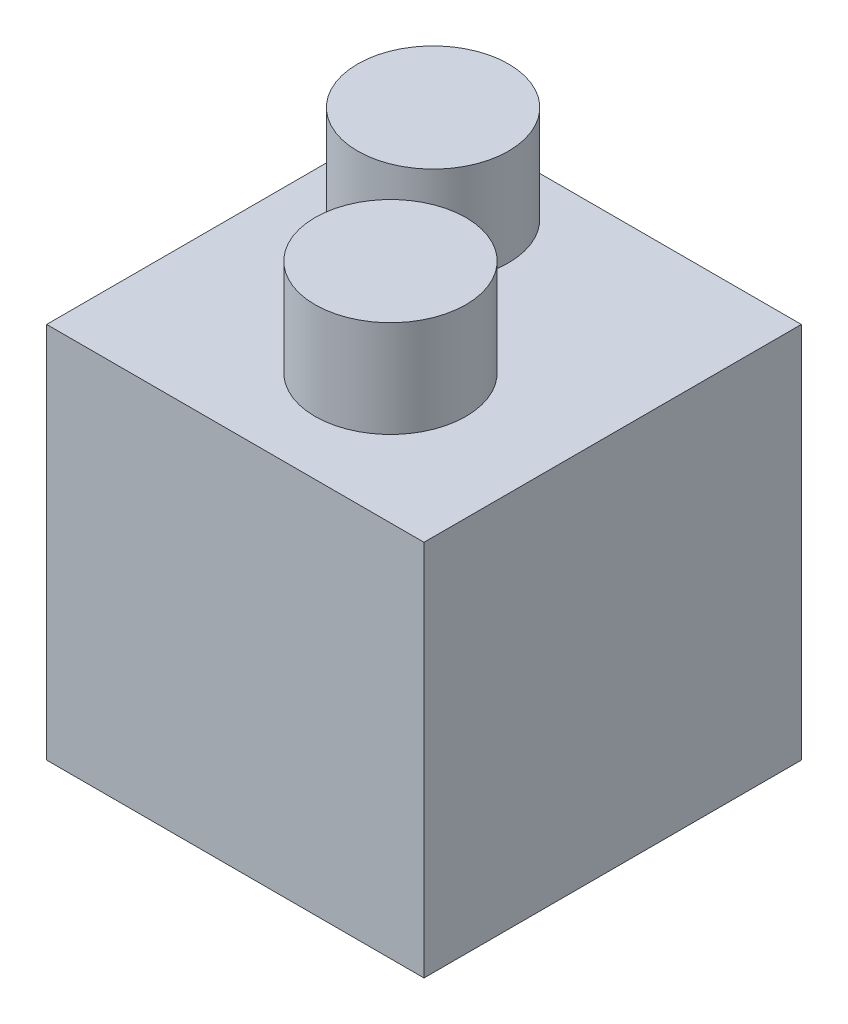
ISO-10303-21;
HEADER;
FILE_DESCRIPTION(('STEP AP214'),'2;1');
FILE_NAME('part.step','',(''),(''),'','','');
FILE_SCHEMA(('AUTOMOTIVE_DESIGN { 1 0 10303 214 1 1 1 1 }'));
ENDSEC;
DATA;
#1=APPLICATION_CONTEXT('core data for automotive mechanical design processes');
#2=APPLICATION_PROTOCOL_DEFINITION('international standard','automotive_design',2000,#1);
#3=PRODUCT_CONTEXT('',#1,'mechanical');
#4=PRODUCT('Part','Part','',(#3));
#5=PRODUCT_RELATED_PRODUCT_CATEGORY('part','',(#4));
#6=PRODUCT_DEFINITION_FORMATION('','',#4);
#7=PRODUCT_DEFINITION_CONTEXT('part definition',#1,'design');
#8=PRODUCT_DEFINITION('design','',#6,#7);
#9=PRODUCT_DEFINITION_SHAPE('','',#8);
#10=(LENGTH_UNIT() NAMED_UNIT(*) SI_UNIT(.MILLI.,.METRE.));
#11=(NAMED_UNIT(*) PLANE_ANGLE_UNIT() SI_UNIT($,.RADIAN.));
#12=(NAMED_UNIT(*) SI_UNIT($,.STERADIAN.) SOLID_ANGLE_UNIT());
#13=UNCERTAINTY_MEASURE_WITH_UNIT(LENGTH_MEASURE(1.E-05),#10,'distance_accuracy_value','');
#14=(GEOMETRIC_REPRESENTATION_CONTEXT(3) GLOBAL_UNCERTAINTY_ASSIGNED_CONTEXT((#13)) GLOBAL_UNIT_ASSIGNED_CONTEXT((#10,
#11,#12)) REPRESENTATION_CONTEXT('',''));
#15=CARTESIAN_POINT('',(0.,0.,0.));
#16=DIRECTION('',(0.,0.,1.));
#17=DIRECTION('',(1.,0.,0.));
#18=AXIS2_PLACEMENT_3D('',#15,#16,#17);
#19=CARTESIAN_POINT('',(9.87027881799935,9.87027881799935,20.));
#20=DIRECTION('',(0.,-1.,0.));
#21=DIRECTION('',(1.,0.,0.));
#22=AXIS2_PLACEMENT_3D('',#19,#20,#21);
#23=PLANE('',#22);
#24=CARTESIAN_POINT('',(15.2845514574461,9.87027881799935,4.93228928323249));
#25=DIRECTION('',(0.,-1.,0.));
#26=DIRECTION('',(1.,0.,0.));
#27=AXIS2_PLACEMENT_3D('',#24,#25,#26);
#28=CIRCLE('',#27,4.);
#29=CARTESIAN_POINT('',(19.2845514574461,9.87027881799935,4.93228928323249));
#30=VERTEX_POINT('',#29);
#31=EDGE_CURVE('E41',#30,#30,#28,.F.);
#32=ORIENTED_EDGE('',*,*,#31,.F.);
#33=EDGE_LOOP('',(#32));
#34=FACE_BOUND('',#33,.T.);
#35=DIRECTION('',(-1.,0.,0.));
#36=VECTOR('',#35,1.);
#37=CARTESIAN_POINT('',(9.87027881799935,9.87027881799935,0.));
#38=LINE('',#37,#36);
#39=CARTESIAN_POINT('',(29.8702788179994,9.87027881799935,0.));
#40=VERTEX_POINT('',#39);
#41=CARTESIAN_POINT('',(9.87027881799935,9.87027881799935,0.));
#42=VERTEX_POINT('',#41);
#43=EDGE_CURVE('E72',#40,#42,#38,.T.);
#44=ORIENTED_EDGE('',*,*,#43,.T.);
#45=DIRECTION('',(0.,0.,-1.));
#46=VECTOR('',#45,1.);
#47=CARTESIAN_POINT('',(9.87027881799935,9.87027881799935,20.));
#48=LINE('',#47,#46);
#49=CARTESIAN_POINT('',(9.87027881799935,9.87027881799935,20.));
#50=VERTEX_POINT('',#49);
#51=EDGE_CURVE('E96',#50,#42,#48,.T.);
#52=ORIENTED_EDGE('',*,*,#51,.F.);
#53=DIRECTION('',(-1.,0.,0.));
#54=VECTOR('',#53,1.);
#55=CARTESIAN_POINT('',(9.87027881799935,9.87027881799935,20.));
#56=LINE('',#55,#54);
#57=CARTESIAN_POINT('',(29.8702788179994,9.87027881799935,20.));
#58=VERTEX_POINT('',#57);
#59=EDGE_CURVE('E49',#58,#50,#56,.T.);
#60=ORIENTED_EDGE('',*,*,#59,.F.);
#61=DIRECTION('',(0.,0.,-1.));
#62=VECTOR('',#61,1.);
#63=CARTESIAN_POINT('',(29.8702788179994,9.87027881799935,20.));
#64=LINE('',#63,#62);
#65=EDGE_CURVE('E92',#58,#40,#64,.T.);
#66=ORIENTED_EDGE('',*,*,#65,.T.);
#67=EDGE_LOOP('',(#44,#52,#60,#66));
#68=FACE_BOUND('',#67,.T.);
#69=CARTESIAN_POINT('',(21.2060612623647,9.87027881799935,13.1122353858409));
#70=DIRECTION('',(0.,-1.,0.));
#71=DIRECTION('',(1.,0.,0.));
#72=AXIS2_PLACEMENT_3D('',#69,#70,#71);
#73=CIRCLE('',#72,4.);
#74=CARTESIAN_POINT('',(25.2060612623647,9.87027881799935,13.1122353858409));
#75=VERTEX_POINT('',#74);
#76=EDGE_CURVE('E11',#75,#75,#73,.F.);
#77=ORIENTED_EDGE('',*,*,#76,.F.);
#78=EDGE_LOOP('',(#77));
#79=FACE_BOUND('',#78,.T.);
#80=ADVANCED_FACE('F32',(#34,#68,#79),#23,.F.);
#81=CARTESIAN_POINT('',(9.87027881799935,9.87027881799935,20.));
#82=DIRECTION('',(1.,0.,0.));
#83=DIRECTION('',(0.,1.,0.));
#84=AXIS2_PLACEMENT_3D('',#81,#82,#83);
#85=PLANE('',#84);
#86=DIRECTION('',(0.,-1.,0.));
#87=VECTOR('',#86,1.);
#88=CARTESIAN_POINT('',(9.87027881799935,9.87027881799935,0.));
#89=LINE('',#88,#87);
#90=CARTESIAN_POINT('',(9.87027881799936,-10.1297211820006,0.));
#91=VERTEX_POINT('',#90);
#92=EDGE_CURVE('E100',#42,#91,#89,.T.);
#93=ORIENTED_EDGE('',*,*,#92,.T.);
#94=DIRECTION('',(0.,0.,-1.));
#95=VECTOR('',#94,1.);
#96=CARTESIAN_POINT('',(9.87027881799936,-10.1297211820006,20.));
#97=LINE('',#96,#95);
#98=CARTESIAN_POINT('',(9.87027881799936,-10.1297211820006,20.));
#99=VERTEX_POINT('',#98);
#100=EDGE_CURVE('E91',#99,#91,#97,.T.);
#101=ORIENTED_EDGE('',*,*,#100,.F.);
#102=DIRECTION('',(0.,-1.,0.));
#103=VECTOR('',#102,1.);
#104=CARTESIAN_POINT('',(9.87027881799935,9.87027881799935,20.));
#105=LINE('',#104,#103);
#106=EDGE_CURVE('E85',#50,#99,#105,.T.);
#107=ORIENTED_EDGE('',*,*,#106,.F.);
#108=ORIENTED_EDGE('',*,*,#51,.T.);
#109=EDGE_LOOP('',(#93,#101,#107,#108));
#110=FACE_BOUND('',#109,.T.);
#111=ADVANCED_FACE('F34',(#110),#85,.F.);
#112=CARTESIAN_POINT('',(9.87027881799936,-10.1297211820006,20.));
#113=DIRECTION('',(0.,1.,0.));
#114=DIRECTION('',(0.,0.,1.));
#115=AXIS2_PLACEMENT_3D('',#112,#113,#114);
#116=PLANE('',#115);
#117=DIRECTION('',(1.,0.,0.));
#118=VECTOR('',#117,1.);
#119=CARTESIAN_POINT('',(9.87027881799936,-10.1297211820006,0.));
#120=LINE('',#119,#118);
#121=CARTESIAN_POINT('',(29.8702788179994,-10.1297211820006,0.));
#122=VERTEX_POINT('',#121);
#123=EDGE_CURVE('E90',#91,#122,#120,.T.);
#124=ORIENTED_EDGE('',*,*,#123,.T.);
#125=DIRECTION('',(0.,0.,-1.));
#126=VECTOR('',#125,1.);
#127=CARTESIAN_POINT('',(29.8702788179994,-10.1297211820006,20.));
#128=LINE('',#127,#126);
#129=CARTESIAN_POINT('',(29.8702788179994,-10.1297211820006,20.));
#130=VERTEX_POINT('',#129);
#131=EDGE_CURVE('E88',#130,#122,#128,.T.);
#132=ORIENTED_EDGE('',*,*,#131,.F.);
#133=DIRECTION('',(1.,0.,0.));
#134=VECTOR('',#133,1.);
#135=CARTESIAN_POINT('',(9.87027881799936,-10.1297211820006,20.));
#136=LINE('',#135,#134);
#137=EDGE_CURVE('E80',#99,#130,#136,.T.);
#138=ORIENTED_EDGE('',*,*,#137,.F.);
#139=ORIENTED_EDGE('',*,*,#100,.T.);
#140=EDGE_LOOP('',(#124,#132,#138,#139));
#141=FACE_BOUND('',#140,.T.);
#142=ADVANCED_FACE('F89',(#141),#116,.F.);
#143=CARTESIAN_POINT('',(29.8702788179994,9.87027881799935,20.));
#144=DIRECTION('',(-1.,0.,0.));
#145=DIRECTION('',(0.,0.,1.));
#146=AXIS2_PLACEMENT_3D('',#143,#144,#145);
#147=PLANE('',#146);
#148=DIRECTION('',(0.,1.,0.));
#149=VECTOR('',#148,1.);
#150=CARTESIAN_POINT('',(29.8702788179994,9.87027881799935,0.));
#151=LINE('',#150,#149);
#152=EDGE_CURVE('E66',#122,#40,#151,.T.);
#153=ORIENTED_EDGE('',*,*,#152,.T.);
#154=ORIENTED_EDGE('',*,*,#65,.F.);
#155=DIRECTION('',(0.,1.,0.));
#156=VECTOR('',#155,1.);
#157=CARTESIAN_POINT('',(29.8702788179994,9.87027881799935,20.));
#158=LINE('',#157,#156);
#159=EDGE_CURVE('E83',#130,#58,#158,.T.);
#160=ORIENTED_EDGE('',*,*,#159,.F.);
#161=ORIENTED_EDGE('',*,*,#131,.T.);
#162=EDGE_LOOP('',(#153,#154,#160,#161));
#163=FACE_BOUND('',#162,.T.);
#164=ADVANCED_FACE('F94',(#163),#147,.F.);
#165=CARTESIAN_POINT('',(0.,0.,20.));
#166=DIRECTION('',(0.,0.,1.));
#167=DIRECTION('',(1.,0.,0.));
#168=AXIS2_PLACEMENT_3D('',#165,#166,#167);
#169=PLANE('',#168);
#170=ORIENTED_EDGE('',*,*,#106,.T.);
#171=ORIENTED_EDGE('',*,*,#137,.T.);
#172=ORIENTED_EDGE('',*,*,#159,.T.);
#173=ORIENTED_EDGE('',*,*,#59,.T.);
#174=EDGE_LOOP('',(#170,#171,#172,#173));
#175=FACE_BOUND('',#174,.T.);
#176=ADVANCED_FACE('F81',(#175),#169,.T.);
#177=CARTESIAN_POINT('',(0.,0.,0.));
#178=DIRECTION('',(0.,0.,1.));
#179=DIRECTION('',(1.,0.,0.));
#180=AXIS2_PLACEMENT_3D('',#177,#178,#179);
#181=PLANE('',#180);
#182=ORIENTED_EDGE('',*,*,#92,.F.);
#183=ORIENTED_EDGE('',*,*,#43,.F.);
#184=ORIENTED_EDGE('',*,*,#152,.F.);
#185=ORIENTED_EDGE('',*,*,#123,.F.);
#186=EDGE_LOOP('',(#182,#183,#184,#185));
#187=FACE_BOUND('',#186,.T.);
#188=ADVANCED_FACE('F137',(#187),#181,.F.);
#189=CARTESIAN_POINT('',(15.2845514574461,15.,4.93228928323249));
#190=DIRECTION('',(0.,-1.,0.));
#191=DIRECTION('',(0.,0.,-1.));
#192=AXIS2_PLACEMENT_3D('',#189,#190,#191);
#193=CYLINDRICAL_SURFACE('',#192,4.);
#194=CARTESIAN_POINT('',(15.2845514574461,15.,4.93228928323249));
#195=DIRECTION('',(0.,1.,0.));
#196=DIRECTION('',(0.,0.,1.));
#197=AXIS2_PLACEMENT_3D('',#194,#195,#196);
#198=CIRCLE('',#197,4.);
#199=CARTESIAN_POINT('',(15.2845514574461,15.,8.93228928323249));
#200=VERTEX_POINT('',#199);
#201=EDGE_CURVE('E103',#200,#200,#198,.T.);
#202=ORIENTED_EDGE('',*,*,#201,.F.);
#203=EDGE_LOOP('',(#202));
#204=FACE_BOUND('',#203,.T.);
#205=ORIENTED_EDGE('',*,*,#31,.T.);
#206=EDGE_LOOP('',(#205));
#207=FACE_BOUND('',#206,.T.);
#208=ADVANCED_FACE('F112',(#204,#207),#193,.T.);
#209=CARTESIAN_POINT('',(15.2845514574461,15.,4.93228928323249));
#210=DIRECTION('',(0.,1.,0.));
#211=DIRECTION('',(0.,0.,1.));
#212=AXIS2_PLACEMENT_3D('',#209,#210,#211);
#213=PLANE('',#212);
#214=ORIENTED_EDGE('',*,*,#201,.T.);
#215=EDGE_LOOP('',(#214));
#216=FACE_BOUND('',#215,.T.);
#217=ADVANCED_FACE('F122',(#216),#213,.T.);
#218=CARTESIAN_POINT('',(21.2060612623647,15.,13.1122353858409));
#219=DIRECTION('',(0.,-1.,0.));
#220=DIRECTION('',(0.,0.,-1.));
#221=AXIS2_PLACEMENT_3D('',#218,#219,#220);
#222=CYLINDRICAL_SURFACE('',#221,4.);
#223=CARTESIAN_POINT('',(21.2060612623647,15.,13.1122353858409));
#224=DIRECTION('',(0.,1.,0.));
#225=DIRECTION('',(0.,0.,1.));
#226=AXIS2_PLACEMENT_3D('',#223,#224,#225);
#227=CIRCLE('',#226,4.);
#228=CARTESIAN_POINT('',(21.2060612623647,15.,17.1122353858409));
#229=VERTEX_POINT('',#228);
#230=EDGE_CURVE('E156',#229,#229,#227,.T.);
#231=ORIENTED_EDGE('',*,*,#230,.F.);
#232=EDGE_LOOP('',(#231));
#233=FACE_BOUND('',#232,.T.);
#234=ORIENTED_EDGE('',*,*,#76,.T.);
#235=EDGE_LOOP('',(#234));
#236=FACE_BOUND('',#235,.T.);
#237=ADVANCED_FACE('F119',(#233,#236),#222,.T.);
#238=CARTESIAN_POINT('',(21.2060612623647,15.,13.1122353858409));
#239=DIRECTION('',(0.,1.,0.));
#240=DIRECTION('',(0.,0.,1.));
#241=AXIS2_PLACEMENT_3D('',#238,#239,#240);
#242=PLANE('',#241);
#243=ORIENTED_EDGE('',*,*,#230,.T.);
#244=EDGE_LOOP('',(#243));
#245=FACE_BOUND('',#244,.T.);
#246=ADVANCED_FACE('F121',(#245),#242,.T.);
#247=CLOSED_SHELL('',(#80,#111,#142,#164,#176,#188,#208,#217,#237,#246));
#248=MANIFOLD_SOLID_BREP('B2',#247);
#249=ADVANCED_BREP_SHAPE_REPRESENTATION('',(#18,#248),#14);
#250=SHAPE_DEFINITION_REPRESENTATION(#9,#249);
ENDSEC;
END-ISO-10303-21;
